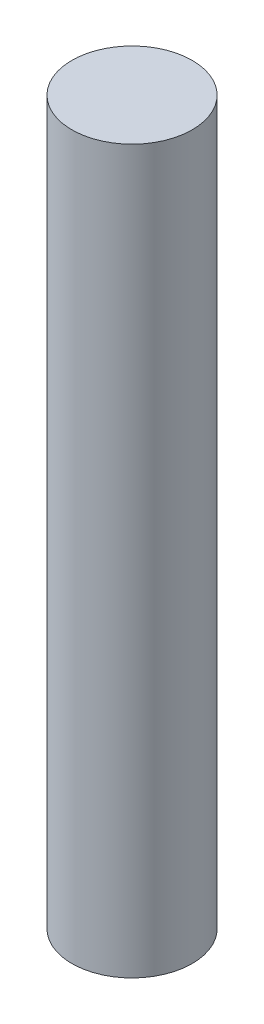
ISO-10303-21;
HEADER;
FILE_DESCRIPTION(('STEP AP214'),'2;1');
FILE_NAME('part.step','',(''),(''),'','','');
FILE_SCHEMA(('AUTOMOTIVE_DESIGN { 1 0 10303 214 1 1 1 1 }'));
ENDSEC;
DATA;
#1=APPLICATION_CONTEXT('core data for automotive mechanical design processes');
#2=APPLICATION_PROTOCOL_DEFINITION('international standard','automotive_design',2000,#1);
#3=PRODUCT_CONTEXT('',#1,'mechanical');
#4=PRODUCT('Part','Part','',(#3));
#5=PRODUCT_RELATED_PRODUCT_CATEGORY('part','',(#4));
#6=PRODUCT_DEFINITION_FORMATION('','',#4);
#7=PRODUCT_DEFINITION_CONTEXT('part definition',#1,'design');
#8=PRODUCT_DEFINITION('design','',#6,#7);
#9=PRODUCT_DEFINITION_SHAPE('','',#8);
#10=(LENGTH_UNIT() NAMED_UNIT(*) SI_UNIT(.MILLI.,.METRE.));
#11=(NAMED_UNIT(*) PLANE_ANGLE_UNIT() SI_UNIT($,.RADIAN.));
#12=(NAMED_UNIT(*) SI_UNIT($,.STERADIAN.) SOLID_ANGLE_UNIT());
#13=UNCERTAINTY_MEASURE_WITH_UNIT(LENGTH_MEASURE(1.E-05),#10,'distance_accuracy_value','');
#14=(GEOMETRIC_REPRESENTATION_CONTEXT(3) GLOBAL_UNCERTAINTY_ASSIGNED_CONTEXT((#13)) GLOBAL_UNIT_ASSIGNED_CONTEXT((#10,
#11,#12)) REPRESENTATION_CONTEXT('',''));
#15=CARTESIAN_POINT('',(0.,0.,0.));
#16=DIRECTION('',(0.,0.,1.));
#17=DIRECTION('',(1.,0.,0.));
#18=AXIS2_PLACEMENT_3D('',#15,#16,#17);
#19=CARTESIAN_POINT('',(-25.,0.,0.));
#20=DIRECTION('',(0.,1.,0.));
#21=DIRECTION('',(0.,0.,1.));
#22=AXIS2_PLACEMENT_3D('',#19,#20,#21);
#23=PLANE('',#22);
#24=CARTESIAN_POINT('',(0.,0.,0.));
#25=DIRECTION('',(0.,-1.,0.));
#26=DIRECTION('',(0.,0.,-1.));
#27=AXIS2_PLACEMENT_3D('',#24,#25,#26);
#28=CIRCLE('',#27,25.);
#29=CARTESIAN_POINT('',(0.,0.,-25.));
#30=VERTEX_POINT('',#29);
#31=EDGE_CURVE('E46',#30,#30,#28,.T.);
#32=ORIENTED_EDGE('',*,*,#31,.T.);
#33=EDGE_LOOP('',(#32));
#34=FACE_BOUND('',#33,.T.);
#35=ADVANCED_FACE('F39',(#34),#23,.F.);
#36=CARTESIAN_POINT('',(0.,300.,0.));
#37=DIRECTION('',(0.,-1.,0.));
#38=DIRECTION('',(0.,0.,-1.));
#39=AXIS2_PLACEMENT_3D('',#36,#37,#38);
#40=PLANE('',#39);
#41=CARTESIAN_POINT('',(0.,300.,0.));
#42=DIRECTION('',(0.,-1.,0.));
#43=DIRECTION('',(0.,0.,-1.));
#44=AXIS2_PLACEMENT_3D('',#41,#42,#43);
#45=CIRCLE('',#44,25.);
#46=CARTESIAN_POINT('',(0.,300.,-25.));
#47=VERTEX_POINT('',#46);
#48=EDGE_CURVE('E10',#47,#47,#45,.T.);
#49=ORIENTED_EDGE('',*,*,#48,.F.);
#50=EDGE_LOOP('',(#49));
#51=FACE_BOUND('',#50,.T.);
#52=ADVANCED_FACE('F56',(#51),#40,.F.);
#53=CARTESIAN_POINT('',(0.,0.,0.));
#54=DIRECTION('',(0.,-1.,0.));
#55=DIRECTION('',(0.,0.,-1.));
#56=AXIS2_PLACEMENT_3D('',#53,#54,#55);
#57=CYLINDRICAL_SURFACE('',#56,25.);
#58=ORIENTED_EDGE('',*,*,#31,.F.);
#59=EDGE_LOOP('',(#58));
#60=FACE_BOUND('',#59,.T.);
#61=ORIENTED_EDGE('',*,*,#48,.T.);
#62=EDGE_LOOP('',(#61));
#63=FACE_BOUND('',#62,.T.);
#64=ADVANCED_FACE('F54',(#60,#63),#57,.T.);
#65=CLOSED_SHELL('',(#35,#52,#64));
#66=MANIFOLD_SOLID_BREP('B2',#65);
#67=ADVANCED_BREP_SHAPE_REPRESENTATION('',(#18,#66),#14);
#68=SHAPE_DEFINITION_REPRESENTATION(#9,#67);
ENDSEC;
END-ISO-10303-21;
